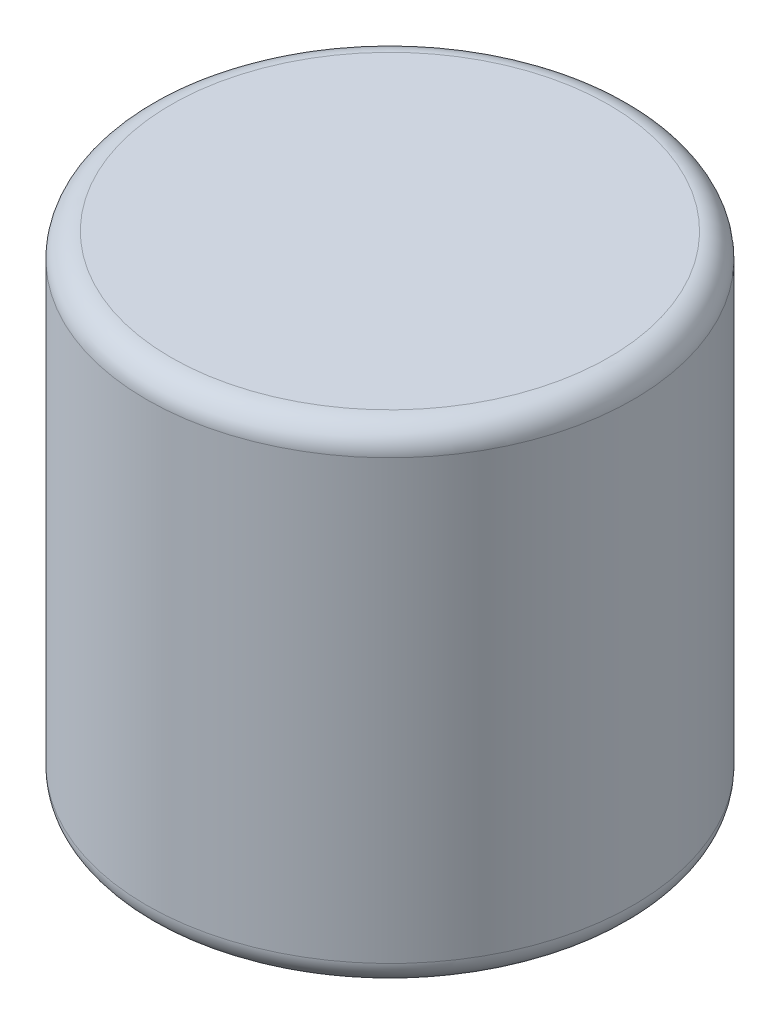
ISO-10303-21;
HEADER;
FILE_DESCRIPTION(('STEP AP214'),'2;1');
FILE_NAME('part.step','',(''),(''),'','','');
FILE_SCHEMA(('AUTOMOTIVE_DESIGN { 1 0 10303 214 1 1 1 1 }'));
ENDSEC;
DATA;
#1=APPLICATION_CONTEXT('core data for automotive mechanical design processes');
#2=APPLICATION_PROTOCOL_DEFINITION('international standard','automotive_design',2000,#1);
#3=PRODUCT_CONTEXT('',#1,'mechanical');
#4=PRODUCT('Part','Part','',(#3));
#5=PRODUCT_RELATED_PRODUCT_CATEGORY('part','',(#4));
#6=PRODUCT_DEFINITION_FORMATION('','',#4);
#7=PRODUCT_DEFINITION_CONTEXT('part definition',#1,'design');
#8=PRODUCT_DEFINITION('design','',#6,#7);
#9=PRODUCT_DEFINITION_SHAPE('','',#8);
#10=(LENGTH_UNIT() NAMED_UNIT(*) SI_UNIT(.MILLI.,.METRE.));
#11=(NAMED_UNIT(*) PLANE_ANGLE_UNIT() SI_UNIT($,.RADIAN.));
#12=(NAMED_UNIT(*) SI_UNIT($,.STERADIAN.) SOLID_ANGLE_UNIT());
#13=UNCERTAINTY_MEASURE_WITH_UNIT(LENGTH_MEASURE(1.E-05),#10,'distance_accuracy_value','');
#14=(GEOMETRIC_REPRESENTATION_CONTEXT(3) GLOBAL_UNCERTAINTY_ASSIGNED_CONTEXT((#13)) GLOBAL_UNIT_ASSIGNED_CONTEXT((#10,
#11,#12)) REPRESENTATION_CONTEXT('',''));
#15=CARTESIAN_POINT('',(0.,0.,0.));
#16=DIRECTION('',(0.,0.,1.));
#17=DIRECTION('',(1.,0.,0.));
#18=AXIS2_PLACEMENT_3D('',#15,#16,#17);
#19=CARTESIAN_POINT('',(0.,10.,0.));
#20=DIRECTION('',(0.,-1.,0.));
#21=DIRECTION('',(0.,0.,-1.));
#22=AXIS2_PLACEMENT_3D('',#19,#20,#21);
#23=CYLINDRICAL_SURFACE('',#22,5.);
#24=CARTESIAN_POINT('',(0.,0.5,0.));
#25=DIRECTION('',(0.,1.,0.));
#26=DIRECTION('',(0.,0.,1.));
#27=AXIS2_PLACEMENT_3D('',#24,#25,#26);
#28=CIRCLE('',#27,5.);
#29=CARTESIAN_POINT('',(0.,0.5,5.));
#30=VERTEX_POINT('',#29);
#31=EDGE_CURVE('E42',#30,#30,#28,.T.);
#32=ORIENTED_EDGE('',*,*,#31,.T.);
#33=EDGE_LOOP('',(#32));
#34=FACE_BOUND('',#33,.T.);
#35=CARTESIAN_POINT('',(0.,9.5,0.));
#36=DIRECTION('',(0.,1.,0.));
#37=DIRECTION('',(0.,0.,1.));
#38=AXIS2_PLACEMENT_3D('',#35,#36,#37);
#39=CIRCLE('',#38,5.);
#40=CARTESIAN_POINT('',(0.,9.5,5.));
#41=VERTEX_POINT('',#40);
#42=EDGE_CURVE('E46',#41,#41,#39,.F.);
#43=ORIENTED_EDGE('',*,*,#42,.T.);
#44=EDGE_LOOP('',(#43));
#45=FACE_BOUND('',#44,.T.);
#46=ADVANCED_FACE('F31',(#34,#45),#23,.T.);
#47=CARTESIAN_POINT('',(0.,10.,0.));
#48=DIRECTION('',(0.,1.,0.));
#49=DIRECTION('',(0.,0.,1.));
#50=AXIS2_PLACEMENT_3D('',#47,#48,#49);
#51=PLANE('',#50);
#52=CARTESIAN_POINT('',(0.,10.,0.));
#53=DIRECTION('',(0.,1.,0.));
#54=DIRECTION('',(0.,0.,1.));
#55=AXIS2_PLACEMENT_3D('',#52,#53,#54);
#56=CIRCLE('',#55,4.5);
#57=CARTESIAN_POINT('',(0.,10.,4.5));
#58=VERTEX_POINT('',#57);
#59=EDGE_CURVE('E10',#58,#58,#56,.T.);
#60=ORIENTED_EDGE('',*,*,#59,.T.);
#61=EDGE_LOOP('',(#60));
#62=FACE_BOUND('',#61,.T.);
#63=ADVANCED_FACE('F62',(#62),#51,.T.);
#64=CARTESIAN_POINT('',(0.,0.,0.));
#65=DIRECTION('',(0.,1.,0.));
#66=DIRECTION('',(0.,0.,1.));
#67=AXIS2_PLACEMENT_3D('',#64,#65,#66);
#68=PLANE('',#67);
#69=CARTESIAN_POINT('',(0.,0.,0.));
#70=DIRECTION('',(0.,1.,0.));
#71=DIRECTION('',(0.,0.,1.));
#72=AXIS2_PLACEMENT_3D('',#69,#70,#71);
#73=CIRCLE('',#72,4.5);
#74=CARTESIAN_POINT('',(0.,0.,4.5));
#75=VERTEX_POINT('',#74);
#76=EDGE_CURVE('E38',#75,#75,#73,.F.);
#77=ORIENTED_EDGE('',*,*,#76,.T.);
#78=EDGE_LOOP('',(#77));
#79=FACE_BOUND('',#78,.T.);
#80=ADVANCED_FACE('F59',(#79),#68,.F.);
#81=CARTESIAN_POINT('',(0.,0.5,0.));
#82=DIRECTION('',(0.,1.,0.));
#83=DIRECTION('',(0.,0.,1.));
#84=AXIS2_PLACEMENT_3D('',#81,#82,#83);
#85=TOROIDAL_SURFACE('',#84,4.5,0.5);
#86=ORIENTED_EDGE('',*,*,#76,.F.);
#87=EDGE_LOOP('',(#86));
#88=FACE_BOUND('',#87,.T.);
#89=ORIENTED_EDGE('',*,*,#31,.F.);
#90=EDGE_LOOP('',(#89));
#91=FACE_BOUND('',#90,.T.);
#92=ADVANCED_FACE('F55',(#88,#91),#85,.T.);
#93=CARTESIAN_POINT('',(0.,9.5,0.));
#94=DIRECTION('',(0.,1.,0.));
#95=DIRECTION('',(0.,0.,1.));
#96=AXIS2_PLACEMENT_3D('',#93,#94,#95);
#97=TOROIDAL_SURFACE('',#96,4.5,0.5);
#98=ORIENTED_EDGE('',*,*,#42,.F.);
#99=EDGE_LOOP('',(#98));
#100=FACE_BOUND('',#99,.T.);
#101=ORIENTED_EDGE('',*,*,#59,.F.);
#102=EDGE_LOOP('',(#101));
#103=FACE_BOUND('',#102,.T.);
#104=ADVANCED_FACE('F33',(#100,#103),#97,.T.);
#105=CLOSED_SHELL('',(#46,#63,#80,#92,#104));
#106=MANIFOLD_SOLID_BREP('B2',#105);
#107=ADVANCED_BREP_SHAPE_REPRESENTATION('',(#18,#106),#14);
#108=SHAPE_DEFINITION_REPRESENTATION(#9,#107);
ENDSEC;
END-ISO-10303-21;
